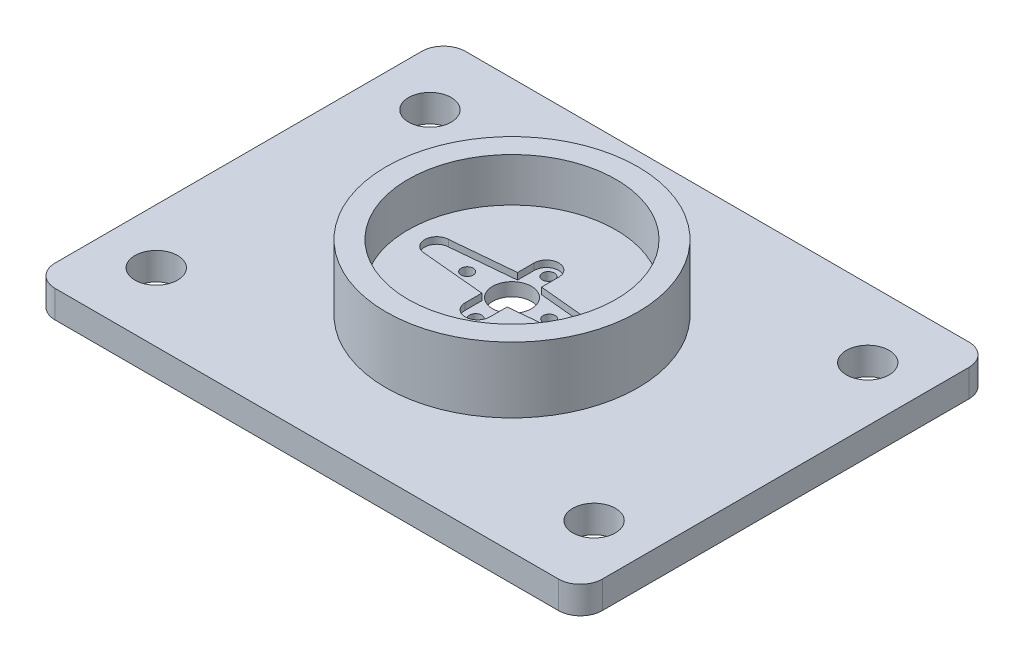
ISO-10303-21;
HEADER;
FILE_DESCRIPTION(('STEP AP214'),'2;1');
FILE_NAME('part.step','',(''),(''),'','','');
FILE_SCHEMA(('AUTOMOTIVE_DESIGN { 1 0 10303 214 1 1 1 1 }'));
ENDSEC;
DATA;
#1=APPLICATION_CONTEXT('core data for automotive mechanical design processes');
#2=APPLICATION_PROTOCOL_DEFINITION('international standard','automotive_design',2000,#1);
#3=PRODUCT_CONTEXT('',#1,'mechanical');
#4=PRODUCT('Part','Part','',(#3));
#5=PRODUCT_RELATED_PRODUCT_CATEGORY('part','',(#4));
#6=PRODUCT_DEFINITION_FORMATION('','',#4);
#7=PRODUCT_DEFINITION_CONTEXT('part definition',#1,'design');
#8=PRODUCT_DEFINITION('design','',#6,#7);
#9=PRODUCT_DEFINITION_SHAPE('','',#8);
#10=(LENGTH_UNIT() NAMED_UNIT(*) SI_UNIT(.MILLI.,.METRE.));
#11=(NAMED_UNIT(*) PLANE_ANGLE_UNIT() SI_UNIT($,.RADIAN.));
#12=(NAMED_UNIT(*) SI_UNIT($,.STERADIAN.) SOLID_ANGLE_UNIT());
#13=UNCERTAINTY_MEASURE_WITH_UNIT(LENGTH_MEASURE(1.E-05),#10,'distance_accuracy_value','');
#14=(GEOMETRIC_REPRESENTATION_CONTEXT(3) GLOBAL_UNCERTAINTY_ASSIGNED_CONTEXT((#13)) GLOBAL_UNIT_ASSIGNED_CONTEXT((#10,
#11,#12)) REPRESENTATION_CONTEXT('',''));
#15=CARTESIAN_POINT('',(0.,0.,0.));
#16=DIRECTION('',(0.,0.,1.));
#17=DIRECTION('',(1.,0.,0.));
#18=AXIS2_PLACEMENT_3D('',#15,#16,#17);
#19=CARTESIAN_POINT('',(0.,9.,0.));
#20=DIRECTION('',(0.,1.,0.));
#21=DIRECTION('',(0.,0.,1.));
#22=AXIS2_PLACEMENT_3D('',#19,#20,#21);
#23=PLANE('',#22);
#24=CARTESIAN_POINT('',(0.,9.,0.));
#25=DIRECTION('',(0.,1.,0.));
#26=DIRECTION('',(0.,0.,1.));
#27=AXIS2_PLACEMENT_3D('',#24,#25,#26);
#28=CIRCLE('',#27,19.);
#29=CARTESIAN_POINT('',(0.,9.,19.));
#30=VERTEX_POINT('',#29);
#31=EDGE_CURVE('E12',#30,#30,#28,.T.);
#32=ORIENTED_EDGE('',*,*,#31,.T.);
#33=EDGE_LOOP('',(#32));
#34=FACE_BOUND('',#33,.T.);
#35=DIRECTION('',(0.,0.,-1.));
#36=VECTOR('',#35,1.);
#37=CARTESIAN_POINT('',(2.25000000000002,9.,0.));
#38=LINE('',#37,#36);
#39=CARTESIAN_POINT('',(2.25000000000002,9.,6.3));
#40=VERTEX_POINT('',#39);
#41=CARTESIAN_POINT('',(2.25000000000002,9.,3.1454929822616));
#42=VERTEX_POINT('',#41);
#43=EDGE_CURVE('E241',#40,#42,#38,.T.);
#44=ORIENTED_EDGE('',*,*,#43,.F.);
#45=CARTESIAN_POINT('',(0.,9.,6.3));
#46=DIRECTION('',(0.,1.,0.));
#47=DIRECTION('',(0.,0.,1.));
#48=AXIS2_PLACEMENT_3D('',#45,#46,#47);
#49=CIRCLE('',#48,2.25000000000002);
#50=CARTESIAN_POINT('',(-2.25000000000002,9.,6.3));
#51=VERTEX_POINT('',#50);
#52=EDGE_CURVE('E246',#40,#51,#49,.F.);
#53=ORIENTED_EDGE('',*,*,#52,.T.);
#54=DIRECTION('',(0.,0.,-1.));
#55=VECTOR('',#54,1.);
#56=CARTESIAN_POINT('',(-2.25000000000002,9.,0.));
#57=LINE('',#56,#55);
#58=CARTESIAN_POINT('',(-2.25000000000002,9.,3.26473049395435));
#59=VERTEX_POINT('',#58);
#60=EDGE_CURVE('E66',#51,#59,#57,.T.);
#61=ORIENTED_EDGE('',*,*,#60,.T.);
#62=DIRECTION('',(0.995754888126229,0.,0.0920445694906601));
#63=VECTOR('',#62,1.);
#64=CARTESIAN_POINT('',(-0.318287509913616,9.,3.44329215270183));
#65=LINE('',#64,#63);
#66=CARTESIAN_POINT('',(-13.7693706378424,9.,2.19991472070841));
#67=VERTEX_POINT('',#66);
#68=EDGE_CURVE('E302',#67,#59,#65,.T.);
#69=ORIENTED_EDGE('',*,*,#68,.F.);
#70=CARTESIAN_POINT('',(-13.75,9.,0.));
#71=DIRECTION('',(0.,1.,0.));
#72=DIRECTION('',(0.,0.,1.));
#73=AXIS2_PLACEMENT_3D('',#70,#71,#72);
#74=CIRCLE('',#73,2.2);
#75=CARTESIAN_POINT('',(-13.7693706378424,9.,-2.19991472070841));
#76=VERTEX_POINT('',#75);
#77=EDGE_CURVE('E299',#76,#67,#74,.T.);
#78=ORIENTED_EDGE('',*,*,#77,.F.);
#79=DIRECTION('',(-0.995754888126229,0.,0.0920445694906599));
#80=VECTOR('',#79,1.);
#81=CARTESIAN_POINT('',(-0.318287509913615,9.,-3.44329215270183));
#82=LINE('',#81,#80);
#83=CARTESIAN_POINT('',(-2.25000000000002,9.,-3.26473049395435));
#84=VERTEX_POINT('',#83);
#85=EDGE_CURVE('E296',#84,#76,#82,.T.);
#86=ORIENTED_EDGE('',*,*,#85,.F.);
#87=DIRECTION('',(0.,0.,1.));
#88=VECTOR('',#87,1.);
#89=CARTESIAN_POINT('',(-2.25000000000002,9.,0.));
#90=LINE('',#89,#88);
#91=CARTESIAN_POINT('',(-2.25000000000002,9.,-6.3));
#92=VERTEX_POINT('',#91);
#93=EDGE_CURVE('E293',#92,#84,#90,.T.);
#94=ORIENTED_EDGE('',*,*,#93,.F.);
#95=CARTESIAN_POINT('',(0.,9.,-6.3));
#96=DIRECTION('',(0.,1.,0.));
#97=DIRECTION('',(0.,0.,1.));
#98=AXIS2_PLACEMENT_3D('',#95,#96,#97);
#99=CIRCLE('',#98,2.25000000000002);
#100=CARTESIAN_POINT('',(2.25000000000002,9.,-6.3));
#101=VERTEX_POINT('',#100);
#102=EDGE_CURVE('E290',#101,#92,#99,.T.);
#103=ORIENTED_EDGE('',*,*,#102,.F.);
#104=CARTESIAN_POINT('',(2.25000000000002,9.,-3.1454929822616));
#105=VERTEX_POINT('',#104);
#106=EDGE_CURVE('E281',#105,#101,#38,.T.);
#107=ORIENTED_EDGE('',*,*,#106,.F.);
#108=DIRECTION('',(0.995477891620518,0.,0.0949935118561688));
#109=VECTOR('',#108,1.);
#110=CARTESIAN_POINT('',(0.317753688889832,9.,-3.32987765258781));
#111=LINE('',#110,#109);
#112=CARTESIAN_POINT('',(16.35,9.,-1.8));
#113=VERTEX_POINT('',#112);
#114=EDGE_CURVE('E287',#105,#113,#111,.T.);
#115=ORIENTED_EDGE('',*,*,#114,.T.);
#116=CARTESIAN_POINT('',(16.35,9.,0.));
#117=DIRECTION('',(0.,1.,0.));
#118=DIRECTION('',(0.,0.,1.));
#119=AXIS2_PLACEMENT_3D('',#116,#117,#118);
#120=CIRCLE('',#119,1.8);
#121=CARTESIAN_POINT('',(16.35,9.,1.8));
#122=VERTEX_POINT('',#121);
#123=EDGE_CURVE('E284',#122,#113,#120,.T.);
#124=ORIENTED_EDGE('',*,*,#123,.F.);
#125=DIRECTION('',(0.995477891620518,0.,-0.0949935118561688));
#126=VECTOR('',#125,1.);
#127=CARTESIAN_POINT('',(0.317753688889832,9.,3.32987765258781));
#128=LINE('',#127,#126);
#129=EDGE_CURVE('E280',#42,#122,#128,.T.);
#130=ORIENTED_EDGE('',*,*,#129,.F.);
#131=EDGE_LOOP('',(#44,#53,#61,#69,#78,#86,#94,#103,#107,#115,#124,#130));
#132=FACE_BOUND('',#131,.T.);
#133=ADVANCED_FACE('F49',(#34,#132),#23,.T.);
#134=CARTESIAN_POINT('',(0.,5.,37.5));
#135=DIRECTION('',(0.,0.,-1.));
#136=DIRECTION('',(-1.,0.,0.));
#137=AXIS2_PLACEMENT_3D('',#134,#135,#136);
#138=PLANE('',#137);
#139=DIRECTION('',(1.,0.,0.));
#140=VECTOR('',#139,1.);
#141=CARTESIAN_POINT('',(0.,0.,37.5));
#142=LINE('',#141,#140);
#143=CARTESIAN_POINT('',(-46.,0.,37.5));
#144=VERTEX_POINT('',#143);
#145=CARTESIAN_POINT('',(46.,0.,37.5));
#146=VERTEX_POINT('',#145);
#147=EDGE_CURVE('E176',#144,#146,#142,.T.);
#148=ORIENTED_EDGE('',*,*,#147,.T.);
#149=DIRECTION('',(0.,-1.,0.));
#150=VECTOR('',#149,1.);
#151=CARTESIAN_POINT('',(46.,5.,37.5));
#152=LINE('',#151,#150);
#153=CARTESIAN_POINT('',(46.,5.,37.5));
#154=VERTEX_POINT('',#153);
#155=EDGE_CURVE('E58',#154,#146,#152,.T.);
#156=ORIENTED_EDGE('',*,*,#155,.F.);
#157=DIRECTION('',(1.,0.,0.));
#158=VECTOR('',#157,1.);
#159=CARTESIAN_POINT('',(0.,5.,37.5));
#160=LINE('',#159,#158);
#161=CARTESIAN_POINT('',(-46.,5.,37.5));
#162=VERTEX_POINT('',#161);
#163=EDGE_CURVE('E360',#162,#154,#160,.T.);
#164=ORIENTED_EDGE('',*,*,#163,.F.);
#165=DIRECTION('',(0.,-1.,0.));
#166=VECTOR('',#165,1.);
#167=CARTESIAN_POINT('',(-46.,5.,37.5));
#168=LINE('',#167,#166);
#169=EDGE_CURVE('E75',#162,#144,#168,.T.);
#170=ORIENTED_EDGE('',*,*,#169,.T.);
#171=EDGE_LOOP('',(#148,#156,#164,#170));
#172=FACE_BOUND('',#171,.T.);
#173=ADVANCED_FACE('F377',(#172),#138,.F.);
#174=CARTESIAN_POINT('',(46.,5.,33.5));
#175=DIRECTION('',(0.,-1.,0.));
#176=DIRECTION('',(0.,0.,-1.));
#177=AXIS2_PLACEMENT_3D('',#174,#175,#176);
#178=CYLINDRICAL_SURFACE('',#177,4.00000000000001);
#179=CARTESIAN_POINT('',(46.,0.,33.5));
#180=DIRECTION('',(0.,1.,0.));
#181=DIRECTION('',(0.,0.,1.));
#182=AXIS2_PLACEMENT_3D('',#179,#180,#181);
#183=CIRCLE('',#182,4.00000000000001);
#184=CARTESIAN_POINT('',(50.,0.,33.5));
#185=VERTEX_POINT('',#184);
#186=EDGE_CURVE('E178',#146,#185,#183,.T.);
#187=ORIENTED_EDGE('',*,*,#186,.T.);
#188=DIRECTION('',(0.,-1.,0.));
#189=VECTOR('',#188,1.);
#190=CARTESIAN_POINT('',(50.,5.,33.5));
#191=LINE('',#190,#189);
#192=CARTESIAN_POINT('',(50.,5.,33.5));
#193=VERTEX_POINT('',#192);
#194=EDGE_CURVE('E204',#193,#185,#191,.T.);
#195=ORIENTED_EDGE('',*,*,#194,.F.);
#196=CARTESIAN_POINT('',(46.,5.,33.5));
#197=DIRECTION('',(0.,1.,0.));
#198=DIRECTION('',(0.,0.,1.));
#199=AXIS2_PLACEMENT_3D('',#196,#197,#198);
#200=CIRCLE('',#199,4.00000000000001);
#201=EDGE_CURVE('E115',#154,#193,#200,.T.);
#202=ORIENTED_EDGE('',*,*,#201,.F.);
#203=ORIENTED_EDGE('',*,*,#155,.T.);
#204=EDGE_LOOP('',(#187,#195,#202,#203));
#205=FACE_BOUND('',#204,.T.);
#206=ADVANCED_FACE('F378',(#205),#178,.T.);
#207=CARTESIAN_POINT('',(50.,5.,0.));
#208=DIRECTION('',(1.,0.,0.));
#209=DIRECTION('',(0.,0.,-1.));
#210=AXIS2_PLACEMENT_3D('',#207,#208,#209);
#211=PLANE('',#210);
#212=DIRECTION('',(0.,0.,1.));
#213=VECTOR('',#212,1.);
#214=CARTESIAN_POINT('',(50.,0.,0.));
#215=LINE('',#214,#213);
#216=CARTESIAN_POINT('',(50.,0.,-33.5));
#217=VERTEX_POINT('',#216);
#218=EDGE_CURVE('E181',#217,#185,#215,.T.);
#219=ORIENTED_EDGE('',*,*,#218,.F.);
#220=DIRECTION('',(0.,-1.,0.));
#221=VECTOR('',#220,1.);
#222=CARTESIAN_POINT('',(50.,5.,-33.5));
#223=LINE('',#222,#221);
#224=CARTESIAN_POINT('',(50.,5.,-33.5));
#225=VERTEX_POINT('',#224);
#226=EDGE_CURVE('E202',#225,#217,#223,.T.);
#227=ORIENTED_EDGE('',*,*,#226,.F.);
#228=DIRECTION('',(0.,0.,1.));
#229=VECTOR('',#228,1.);
#230=CARTESIAN_POINT('',(50.,5.,0.));
#231=LINE('',#230,#229);
#232=EDGE_CURVE('E363',#225,#193,#231,.T.);
#233=ORIENTED_EDGE('',*,*,#232,.T.);
#234=ORIENTED_EDGE('',*,*,#194,.T.);
#235=EDGE_LOOP('',(#219,#227,#233,#234));
#236=FACE_BOUND('',#235,.T.);
#237=ADVANCED_FACE('F381',(#236),#211,.T.);
#238=CARTESIAN_POINT('',(46.,5.,-33.5));
#239=DIRECTION('',(0.,-1.,0.));
#240=DIRECTION('',(0.,0.,-1.));
#241=AXIS2_PLACEMENT_3D('',#238,#239,#240);
#242=CYLINDRICAL_SURFACE('',#241,4.00000000000001);
#243=CARTESIAN_POINT('',(46.,0.,-33.5));
#244=DIRECTION('',(0.,1.,0.));
#245=DIRECTION('',(0.,0.,1.));
#246=AXIS2_PLACEMENT_3D('',#243,#244,#245);
#247=CIRCLE('',#246,4.00000000000001);
#248=CARTESIAN_POINT('',(46.,0.,-37.5));
#249=VERTEX_POINT('',#248);
#250=EDGE_CURVE('E184',#249,#217,#247,.F.);
#251=ORIENTED_EDGE('',*,*,#250,.F.);
#252=DIRECTION('',(0.,-1.,0.));
#253=VECTOR('',#252,1.);
#254=CARTESIAN_POINT('',(46.,5.,-37.5));
#255=LINE('',#254,#253);
#256=CARTESIAN_POINT('',(46.,5.,-37.5));
#257=VERTEX_POINT('',#256);
#258=EDGE_CURVE('E200',#257,#249,#255,.T.);
#259=ORIENTED_EDGE('',*,*,#258,.F.);
#260=CARTESIAN_POINT('',(46.,5.,-33.5));
#261=DIRECTION('',(0.,1.,0.));
#262=DIRECTION('',(0.,0.,1.));
#263=AXIS2_PLACEMENT_3D('',#260,#261,#262);
#264=CIRCLE('',#263,4.00000000000001);
#265=EDGE_CURVE('E366',#257,#225,#264,.F.);
#266=ORIENTED_EDGE('',*,*,#265,.T.);
#267=ORIENTED_EDGE('',*,*,#226,.T.);
#268=EDGE_LOOP('',(#251,#259,#266,#267));
#269=FACE_BOUND('',#268,.T.);
#270=ADVANCED_FACE('F383',(#269),#242,.T.);
#271=CARTESIAN_POINT('',(0.,5.,-37.5));
#272=DIRECTION('',(0.,0.,-1.));
#273=DIRECTION('',(-1.,0.,0.));
#274=AXIS2_PLACEMENT_3D('',#271,#272,#273);
#275=PLANE('',#274);
#276=DIRECTION('',(1.,0.,0.));
#277=VECTOR('',#276,1.);
#278=CARTESIAN_POINT('',(0.,0.,-37.5));
#279=LINE('',#278,#277);
#280=CARTESIAN_POINT('',(-46.,0.,-37.5));
#281=VERTEX_POINT('',#280);
#282=EDGE_CURVE('E187',#281,#249,#279,.T.);
#283=ORIENTED_EDGE('',*,*,#282,.F.);
#284=DIRECTION('',(0.,-1.,0.));
#285=VECTOR('',#284,1.);
#286=CARTESIAN_POINT('',(-46.,5.,-37.5));
#287=LINE('',#286,#285);
#288=CARTESIAN_POINT('',(-46.,5.,-37.5));
#289=VERTEX_POINT('',#288);
#290=EDGE_CURVE('E154',#289,#281,#287,.T.);
#291=ORIENTED_EDGE('',*,*,#290,.F.);
#292=DIRECTION('',(1.,0.,0.));
#293=VECTOR('',#292,1.);
#294=CARTESIAN_POINT('',(0.,5.,-37.5));
#295=LINE('',#294,#293);
#296=EDGE_CURVE('E143',#289,#257,#295,.T.);
#297=ORIENTED_EDGE('',*,*,#296,.T.);
#298=ORIENTED_EDGE('',*,*,#258,.T.);
#299=EDGE_LOOP('',(#283,#291,#297,#298));
#300=FACE_BOUND('',#299,.T.);
#301=ADVANCED_FACE('F370',(#300),#275,.T.);
#302=CARTESIAN_POINT('',(-46.,5.,-33.5));
#303=DIRECTION('',(0.,-1.,0.));
#304=DIRECTION('',(0.,0.,-1.));
#305=AXIS2_PLACEMENT_3D('',#302,#303,#304);
#306=CYLINDRICAL_SURFACE('',#305,4.00000000000001);
#307=CARTESIAN_POINT('',(-46.,0.,-33.5));
#308=DIRECTION('',(0.,1.,0.));
#309=DIRECTION('',(0.,0.,1.));
#310=AXIS2_PLACEMENT_3D('',#307,#308,#309);
#311=CIRCLE('',#310,4.00000000000001);
#312=CARTESIAN_POINT('',(-50.,0.,-33.5));
#313=VERTEX_POINT('',#312);
#314=EDGE_CURVE('E150',#281,#313,#311,.T.);
#315=ORIENTED_EDGE('',*,*,#314,.T.);
#316=DIRECTION('',(0.,-1.,0.));
#317=VECTOR('',#316,1.);
#318=CARTESIAN_POINT('',(-50.,5.,-33.5));
#319=LINE('',#318,#317);
#320=CARTESIAN_POINT('',(-50.,5.,-33.5));
#321=VERTEX_POINT('',#320);
#322=EDGE_CURVE('E147',#321,#313,#319,.T.);
#323=ORIENTED_EDGE('',*,*,#322,.F.);
#324=CARTESIAN_POINT('',(-46.,5.,-33.5));
#325=DIRECTION('',(0.,1.,0.));
#326=DIRECTION('',(0.,0.,1.));
#327=AXIS2_PLACEMENT_3D('',#324,#325,#326);
#328=CIRCLE('',#327,4.00000000000001);
#329=EDGE_CURVE('E134',#289,#321,#328,.T.);
#330=ORIENTED_EDGE('',*,*,#329,.F.);
#331=ORIENTED_EDGE('',*,*,#290,.T.);
#332=EDGE_LOOP('',(#315,#323,#330,#331));
#333=FACE_BOUND('',#332,.T.);
#334=ADVANCED_FACE('F148',(#333),#306,.T.);
#335=CARTESIAN_POINT('',(-50.,5.,0.));
#336=DIRECTION('',(1.,0.,0.));
#337=DIRECTION('',(0.,0.,-1.));
#338=AXIS2_PLACEMENT_3D('',#335,#336,#337);
#339=PLANE('',#338);
#340=DIRECTION('',(0.,0.,1.));
#341=VECTOR('',#340,1.);
#342=CARTESIAN_POINT('',(-50.,0.,0.));
#343=LINE('',#342,#341);
#344=CARTESIAN_POINT('',(-50.,0.,33.5));
#345=VERTEX_POINT('',#344);
#346=EDGE_CURVE('E191',#313,#345,#343,.T.);
#347=ORIENTED_EDGE('',*,*,#346,.T.);
#348=DIRECTION('',(0.,-1.,0.));
#349=VECTOR('',#348,1.);
#350=CARTESIAN_POINT('',(-50.,5.,33.5));
#351=LINE('',#350,#349);
#352=CARTESIAN_POINT('',(-50.,5.,33.5));
#353=VERTEX_POINT('',#352);
#354=EDGE_CURVE('E155',#353,#345,#351,.T.);
#355=ORIENTED_EDGE('',*,*,#354,.F.);
#356=DIRECTION('',(0.,0.,1.));
#357=VECTOR('',#356,1.);
#358=CARTESIAN_POINT('',(-50.,5.,0.));
#359=LINE('',#358,#357);
#360=EDGE_CURVE('E139',#321,#353,#359,.T.);
#361=ORIENTED_EDGE('',*,*,#360,.F.);
#362=ORIENTED_EDGE('',*,*,#322,.T.);
#363=EDGE_LOOP('',(#347,#355,#361,#362));
#364=FACE_BOUND('',#363,.T.);
#365=ADVANCED_FACE('F157',(#364),#339,.F.);
#366=CARTESIAN_POINT('',(40.,5.,-25.));
#367=DIRECTION('',(0.,-1.,0.));
#368=DIRECTION('',(0.,0.,-1.));
#369=AXIS2_PLACEMENT_3D('',#366,#367,#368);
#370=CYLINDRICAL_SURFACE('',#369,3.9);
#371=CARTESIAN_POINT('',(40.,5.,-25.));
#372=DIRECTION('',(0.,1.,0.));
#373=DIRECTION('',(0.,0.,1.));
#374=AXIS2_PLACEMENT_3D('',#371,#372,#373);
#375=CIRCLE('',#374,3.9);
#376=CARTESIAN_POINT('',(40.,5.,-21.1));
#377=VERTEX_POINT('',#376);
#378=EDGE_CURVE('E357',#377,#377,#375,.F.);
#379=ORIENTED_EDGE('',*,*,#378,.F.);
#380=EDGE_LOOP('',(#379));
#381=FACE_BOUND('',#380,.T.);
#382=CARTESIAN_POINT('',(40.,0.,-25.));
#383=DIRECTION('',(0.,1.,0.));
#384=DIRECTION('',(0.,0.,1.));
#385=AXIS2_PLACEMENT_3D('',#382,#383,#384);
#386=CIRCLE('',#385,3.9);
#387=CARTESIAN_POINT('',(40.,0.,-21.1));
#388=VERTEX_POINT('',#387);
#389=EDGE_CURVE('E173',#388,#388,#386,.F.);
#390=ORIENTED_EDGE('',*,*,#389,.T.);
#391=EDGE_LOOP('',(#390));
#392=FACE_BOUND('',#391,.T.);
#393=ADVANCED_FACE('F428',(#381,#392),#370,.F.);
#394=CARTESIAN_POINT('',(40.,5.,25.));
#395=DIRECTION('',(0.,-1.,0.));
#396=DIRECTION('',(0.,0.,-1.));
#397=AXIS2_PLACEMENT_3D('',#394,#395,#396);
#398=CYLINDRICAL_SURFACE('',#397,3.9);
#399=CARTESIAN_POINT('',(40.,5.,25.));
#400=DIRECTION('',(0.,1.,0.));
#401=DIRECTION('',(0.,0.,1.));
#402=AXIS2_PLACEMENT_3D('',#399,#400,#401);
#403=CIRCLE('',#402,3.9);
#404=CARTESIAN_POINT('',(40.,5.,28.9));
#405=VERTEX_POINT('',#404);
#406=EDGE_CURVE('E354',#405,#405,#403,.T.);
#407=ORIENTED_EDGE('',*,*,#406,.T.);
#408=EDGE_LOOP('',(#407));
#409=FACE_BOUND('',#408,.T.);
#410=CARTESIAN_POINT('',(40.,0.,25.));
#411=DIRECTION('',(0.,1.,0.));
#412=DIRECTION('',(0.,0.,1.));
#413=AXIS2_PLACEMENT_3D('',#410,#411,#412);
#414=CIRCLE('',#413,3.9);
#415=CARTESIAN_POINT('',(40.,0.,28.9));
#416=VERTEX_POINT('',#415);
#417=EDGE_CURVE('E170',#416,#416,#414,.T.);
#418=ORIENTED_EDGE('',*,*,#417,.F.);
#419=EDGE_LOOP('',(#418));
#420=FACE_BOUND('',#419,.T.);
#421=ADVANCED_FACE('F446',(#409,#420),#398,.F.);
#422=CARTESIAN_POINT('',(-40.,5.,-25.));
#423=DIRECTION('',(0.,-1.,0.));
#424=DIRECTION('',(0.,0.,-1.));
#425=AXIS2_PLACEMENT_3D('',#422,#423,#424);
#426=CYLINDRICAL_SURFACE('',#425,3.9);
#427=CARTESIAN_POINT('',(-40.,5.,-25.));
#428=DIRECTION('',(0.,1.,0.));
#429=DIRECTION('',(0.,0.,1.));
#430=AXIS2_PLACEMENT_3D('',#427,#428,#429);
#431=CIRCLE('',#430,3.9);
#432=CARTESIAN_POINT('',(-40.,5.,-21.1));
#433=VERTEX_POINT('',#432);
#434=EDGE_CURVE('E351',#433,#433,#431,.T.);
#435=ORIENTED_EDGE('',*,*,#434,.T.);
#436=EDGE_LOOP('',(#435));
#437=FACE_BOUND('',#436,.T.);
#438=CARTESIAN_POINT('',(-40.,0.,-25.));
#439=DIRECTION('',(0.,1.,0.));
#440=DIRECTION('',(0.,0.,1.));
#441=AXIS2_PLACEMENT_3D('',#438,#439,#440);
#442=CIRCLE('',#441,3.9);
#443=CARTESIAN_POINT('',(-40.,0.,-21.1));
#444=VERTEX_POINT('',#443);
#445=EDGE_CURVE('E166',#444,#444,#442,.T.);
#446=ORIENTED_EDGE('',*,*,#445,.F.);
#447=EDGE_LOOP('',(#446));
#448=FACE_BOUND('',#447,.T.);
#449=ADVANCED_FACE('F455',(#437,#448),#426,.F.);
#450=CARTESIAN_POINT('',(-40.,5.,25.));
#451=DIRECTION('',(0.,-1.,0.));
#452=DIRECTION('',(0.,0.,-1.));
#453=AXIS2_PLACEMENT_3D('',#450,#451,#452);
#454=CYLINDRICAL_SURFACE('',#453,3.9);
#455=CARTESIAN_POINT('',(-40.,5.,25.));
#456=DIRECTION('',(0.,1.,0.));
#457=DIRECTION('',(0.,0.,1.));
#458=AXIS2_PLACEMENT_3D('',#455,#456,#457);
#459=CIRCLE('',#458,3.9);
#460=CARTESIAN_POINT('',(-40.,5.,28.9));
#461=VERTEX_POINT('',#460);
#462=EDGE_CURVE('E196',#461,#461,#459,.F.);
#463=ORIENTED_EDGE('',*,*,#462,.F.);
#464=EDGE_LOOP('',(#463));
#465=FACE_BOUND('',#464,.T.);
#466=CARTESIAN_POINT('',(-40.,0.,25.));
#467=DIRECTION('',(0.,1.,0.));
#468=DIRECTION('',(0.,0.,1.));
#469=AXIS2_PLACEMENT_3D('',#466,#467,#468);
#470=CIRCLE('',#469,3.9);
#471=CARTESIAN_POINT('',(-40.,0.,28.9));
#472=VERTEX_POINT('',#471);
#473=EDGE_CURVE('E163',#472,#472,#470,.F.);
#474=ORIENTED_EDGE('',*,*,#473,.T.);
#475=EDGE_LOOP('',(#474));
#476=FACE_BOUND('',#475,.T.);
#477=ADVANCED_FACE('F51',(#465,#476),#454,.F.);
#478=CARTESIAN_POINT('',(-46.,5.,33.5));
#479=DIRECTION('',(0.,-1.,0.));
#480=DIRECTION('',(0.,0.,-1.));
#481=AXIS2_PLACEMENT_3D('',#478,#479,#480);
#482=CYLINDRICAL_SURFACE('',#481,4.00000000000001);
#483=CARTESIAN_POINT('',(-46.,0.,33.5));
#484=DIRECTION('',(0.,1.,0.));
#485=DIRECTION('',(0.,0.,1.));
#486=AXIS2_PLACEMENT_3D('',#483,#484,#485);
#487=CIRCLE('',#486,4.00000000000001);
#488=EDGE_CURVE('E193',#144,#345,#487,.F.);
#489=ORIENTED_EDGE('',*,*,#488,.F.);
#490=ORIENTED_EDGE('',*,*,#169,.F.);
#491=CARTESIAN_POINT('',(-46.,5.,33.5));
#492=DIRECTION('',(0.,1.,0.));
#493=DIRECTION('',(0.,0.,1.));
#494=AXIS2_PLACEMENT_3D('',#491,#492,#493);
#495=CIRCLE('',#494,4.00000000000001);
#496=EDGE_CURVE('E158',#162,#353,#495,.F.);
#497=ORIENTED_EDGE('',*,*,#496,.T.);
#498=ORIENTED_EDGE('',*,*,#354,.T.);
#499=EDGE_LOOP('',(#489,#490,#497,#498));
#500=FACE_BOUND('',#499,.T.);
#501=ADVANCED_FACE('F374',(#500),#482,.T.);
#502=CARTESIAN_POINT('',(0.,5.,0.));
#503=DIRECTION('',(0.,1.,0.));
#504=DIRECTION('',(0.,0.,1.));
#505=AXIS2_PLACEMENT_3D('',#502,#503,#504);
#506=PLANE('',#505);
#507=CARTESIAN_POINT('',(0.,5.,0.));
#508=DIRECTION('',(0.,1.,0.));
#509=DIRECTION('',(0.,0.,1.));
#510=AXIS2_PLACEMENT_3D('',#507,#508,#509);
#511=CIRCLE('',#510,23.);
#512=CARTESIAN_POINT('',(0.,5.,23.));
#513=VERTEX_POINT('',#512);
#514=EDGE_CURVE('E344',#513,#513,#511,.T.);
#515=ORIENTED_EDGE('',*,*,#514,.F.);
#516=EDGE_LOOP('',(#515));
#517=FACE_BOUND('',#516,.T.);
#518=ORIENTED_EDGE('',*,*,#462,.T.);
#519=EDGE_LOOP('',(#518));
#520=FACE_BOUND('',#519,.T.);
#521=ORIENTED_EDGE('',*,*,#434,.F.);
#522=EDGE_LOOP('',(#521));
#523=FACE_BOUND('',#522,.T.);
#524=ORIENTED_EDGE('',*,*,#406,.F.);
#525=EDGE_LOOP('',(#524));
#526=FACE_BOUND('',#525,.T.);
#527=ORIENTED_EDGE('',*,*,#378,.T.);
#528=EDGE_LOOP('',(#527));
#529=FACE_BOUND('',#528,.T.);
#530=ORIENTED_EDGE('',*,*,#163,.T.);
#531=ORIENTED_EDGE('',*,*,#201,.T.);
#532=ORIENTED_EDGE('',*,*,#232,.F.);
#533=ORIENTED_EDGE('',*,*,#265,.F.);
#534=ORIENTED_EDGE('',*,*,#296,.F.);
#535=ORIENTED_EDGE('',*,*,#329,.T.);
#536=ORIENTED_EDGE('',*,*,#360,.T.);
#537=ORIENTED_EDGE('',*,*,#496,.F.);
#538=EDGE_LOOP('',(#530,#531,#532,#533,#534,#535,#536,#537));
#539=FACE_BOUND('',#538,.T.);
#540=ADVANCED_FACE('F136',(#517,#520,#523,#526,#529,#539),#506,.T.);
#541=CARTESIAN_POINT('',(0.,0.,0.));
#542=DIRECTION('',(0.,1.,0.));
#543=DIRECTION('',(0.,0.,1.));
#544=AXIS2_PLACEMENT_3D('',#541,#542,#543);
#545=PLANE('',#544);
#546=CARTESIAN_POINT('',(0.,0.,0.));
#547=DIRECTION('',(0.,-1.,0.));
#548=DIRECTION('',(0.,0.,-1.));
#549=AXIS2_PLACEMENT_3D('',#546,#547,#548);
#550=CIRCLE('',#549,19.);
#551=CARTESIAN_POINT('',(0.,0.,-19.));
#552=VERTEX_POINT('',#551);
#553=EDGE_CURVE('E226',#552,#552,#550,.T.);
#554=ORIENTED_EDGE('',*,*,#553,.F.);
#555=EDGE_LOOP('',(#554));
#556=FACE_BOUND('',#555,.T.);
#557=ORIENTED_EDGE('',*,*,#473,.F.);
#558=EDGE_LOOP('',(#557));
#559=FACE_BOUND('',#558,.T.);
#560=ORIENTED_EDGE('',*,*,#445,.T.);
#561=EDGE_LOOP('',(#560));
#562=FACE_BOUND('',#561,.T.);
#563=ORIENTED_EDGE('',*,*,#417,.T.);
#564=EDGE_LOOP('',(#563));
#565=FACE_BOUND('',#564,.T.);
#566=ORIENTED_EDGE('',*,*,#389,.F.);
#567=EDGE_LOOP('',(#566));
#568=FACE_BOUND('',#567,.T.);
#569=ORIENTED_EDGE('',*,*,#147,.F.);
#570=ORIENTED_EDGE('',*,*,#488,.T.);
#571=ORIENTED_EDGE('',*,*,#346,.F.);
#572=ORIENTED_EDGE('',*,*,#314,.F.);
#573=ORIENTED_EDGE('',*,*,#282,.T.);
#574=ORIENTED_EDGE('',*,*,#250,.T.);
#575=ORIENTED_EDGE('',*,*,#218,.T.);
#576=ORIENTED_EDGE('',*,*,#186,.F.);
#577=EDGE_LOOP('',(#569,#570,#571,#572,#573,#574,#575,#576));
#578=FACE_BOUND('',#577,.T.);
#579=ADVANCED_FACE('F373',(#556,#559,#562,#565,#568,#578),#545,.F.);
#580=CARTESIAN_POINT('',(0.,17.,0.));
#581=DIRECTION('',(0.,1.,0.));
#582=DIRECTION('',(0.,0.,1.));
#583=AXIS2_PLACEMENT_3D('',#580,#581,#582);
#584=PLANE('',#583);
#585=CARTESIAN_POINT('',(0.,17.,0.));
#586=DIRECTION('',(0.,1.,0.));
#587=DIRECTION('',(0.,0.,1.));
#588=AXIS2_PLACEMENT_3D('',#585,#586,#587);
#589=CIRCLE('',#588,23.);
#590=CARTESIAN_POINT('',(0.,17.,23.));
#591=VERTEX_POINT('',#590);
#592=EDGE_CURVE('E167',#591,#591,#589,.T.);
#593=ORIENTED_EDGE('',*,*,#592,.T.);
#594=EDGE_LOOP('',(#593));
#595=FACE_BOUND('',#594,.T.);
#596=CARTESIAN_POINT('',(0.,17.,0.));
#597=DIRECTION('',(0.,1.,0.));
#598=DIRECTION('',(0.,0.,1.));
#599=AXIS2_PLACEMENT_3D('',#596,#597,#598);
#600=CIRCLE('',#599,19.);
#601=CARTESIAN_POINT('',(0.,17.,19.));
#602=VERTEX_POINT('',#601);
#603=EDGE_CURVE('E311',#602,#602,#600,.T.);
#604=ORIENTED_EDGE('',*,*,#603,.F.);
#605=EDGE_LOOP('',(#604));
#606=FACE_BOUND('',#605,.T.);
#607=ADVANCED_FACE('F411',(#595,#606),#584,.T.);
#608=CARTESIAN_POINT('',(0.,17.,0.));
#609=DIRECTION('',(0.,-1.,0.));
#610=DIRECTION('',(0.,0.,-1.));
#611=AXIS2_PLACEMENT_3D('',#608,#609,#610);
#612=CYLINDRICAL_SURFACE('',#611,23.);
#613=ORIENTED_EDGE('',*,*,#592,.F.);
#614=EDGE_LOOP('',(#613));
#615=FACE_BOUND('',#614,.T.);
#616=ORIENTED_EDGE('',*,*,#514,.T.);
#617=EDGE_LOOP('',(#616));
#618=FACE_BOUND('',#617,.T.);
#619=ADVANCED_FACE('F409',(#615,#618),#612,.T.);
#620=CARTESIAN_POINT('',(0.,17.,0.));
#621=DIRECTION('',(0.,-1.,0.));
#622=DIRECTION('',(0.,0.,-1.));
#623=AXIS2_PLACEMENT_3D('',#620,#621,#622);
#624=CYLINDRICAL_SURFACE('',#623,19.);
#625=ORIENTED_EDGE('',*,*,#31,.F.);
#626=EDGE_LOOP('',(#625));
#627=FACE_BOUND('',#626,.T.);
#628=ORIENTED_EDGE('',*,*,#603,.T.);
#629=EDGE_LOOP('',(#628));
#630=FACE_BOUND('',#629,.T.);
#631=ADVANCED_FACE('F406',(#627,#630),#624,.F.);
#632=CARTESIAN_POINT('',(2.25000000000002,7.8,0.));
#633=DIRECTION('',(1.,0.,0.));
#634=DIRECTION('',(0.,0.,-1.));
#635=AXIS2_PLACEMENT_3D('',#632,#633,#634);
#636=PLANE('',#635);
#637=ORIENTED_EDGE('',*,*,#43,.T.);
#638=DIRECTION('',(0.,1.,0.));
#639=VECTOR('',#638,1.);
#640=CARTESIAN_POINT('',(2.25000000000002,7.8,3.1454929822616));
#641=LINE('',#640,#639);
#642=CARTESIAN_POINT('',(2.25000000000002,7.8,3.1454929822616));
#643=VERTEX_POINT('',#642);
#644=EDGE_CURVE('E277',#643,#42,#641,.T.);
#645=ORIENTED_EDGE('',*,*,#644,.F.);
#646=DIRECTION('',(0.,0.,-1.));
#647=VECTOR('',#646,1.);
#648=CARTESIAN_POINT('',(2.25000000000002,7.8,0.));
#649=LINE('',#648,#647);
#650=CARTESIAN_POINT('',(2.25000000000002,7.8,6.3));
#651=VERTEX_POINT('',#650);
#652=EDGE_CURVE('E242',#651,#643,#649,.T.);
#653=ORIENTED_EDGE('',*,*,#652,.F.);
#654=DIRECTION('',(0.,1.,0.));
#655=VECTOR('',#654,1.);
#656=CARTESIAN_POINT('',(2.25000000000002,7.8,6.3));
#657=LINE('',#656,#655);
#658=EDGE_CURVE('E308',#651,#40,#657,.T.);
#659=ORIENTED_EDGE('',*,*,#658,.T.);
#660=EDGE_LOOP('',(#637,#645,#653,#659));
#661=FACE_BOUND('',#660,.T.);
#662=ADVANCED_FACE('F408',(#661),#636,.F.);
#663=CARTESIAN_POINT('',(0.,7.8,6.3));
#664=DIRECTION('',(0.,1.,0.));
#665=DIRECTION('',(0.,0.,1.));
#666=AXIS2_PLACEMENT_3D('',#663,#664,#665);
#667=CYLINDRICAL_SURFACE('',#666,2.25000000000002);
#668=ORIENTED_EDGE('',*,*,#52,.F.);
#669=ORIENTED_EDGE('',*,*,#658,.F.);
#670=CARTESIAN_POINT('',(0.,7.8,6.3));
#671=DIRECTION('',(0.,1.,0.));
#672=DIRECTION('',(0.,0.,1.));
#673=AXIS2_PLACEMENT_3D('',#670,#671,#672);
#674=CIRCLE('',#673,2.25000000000002);
#675=CARTESIAN_POINT('',(-2.25000000000002,7.8,6.3));
#676=VERTEX_POINT('',#675);
#677=EDGE_CURVE('E274',#651,#676,#674,.F.);
#678=ORIENTED_EDGE('',*,*,#677,.T.);
#679=DIRECTION('',(0.,1.,0.));
#680=VECTOR('',#679,1.);
#681=CARTESIAN_POINT('',(-2.25000000000002,7.8,6.3));
#682=LINE('',#681,#680);
#683=EDGE_CURVE('E312',#676,#51,#682,.T.);
#684=ORIENTED_EDGE('',*,*,#683,.T.);
#685=EDGE_LOOP('',(#668,#669,#678,#684));
#686=FACE_BOUND('',#685,.T.);
#687=ADVANCED_FACE('F510',(#686),#667,.F.);
#688=CARTESIAN_POINT('',(-2.25000000000002,7.8,0.));
#689=DIRECTION('',(1.,0.,0.));
#690=DIRECTION('',(0.,0.,-1.));
#691=AXIS2_PLACEMENT_3D('',#688,#689,#690);
#692=PLANE('',#691);
#693=ORIENTED_EDGE('',*,*,#60,.F.);
#694=ORIENTED_EDGE('',*,*,#683,.F.);
#695=DIRECTION('',(0.,0.,-1.));
#696=VECTOR('',#695,1.);
#697=CARTESIAN_POINT('',(-2.25000000000002,7.8,0.));
#698=LINE('',#697,#696);
#699=CARTESIAN_POINT('',(-2.25000000000002,7.8,3.26473049395435));
#700=VERTEX_POINT('',#699);
#701=EDGE_CURVE('E271',#676,#700,#698,.T.);
#702=ORIENTED_EDGE('',*,*,#701,.T.);
#703=DIRECTION('',(0.,1.,0.));
#704=VECTOR('',#703,1.);
#705=CARTESIAN_POINT('',(-2.25000000000002,7.8,3.26473049395435));
#706=LINE('',#705,#704);
#707=EDGE_CURVE('E314',#700,#59,#706,.T.);
#708=ORIENTED_EDGE('',*,*,#707,.T.);
#709=EDGE_LOOP('',(#693,#694,#702,#708));
#710=FACE_BOUND('',#709,.T.);
#711=ADVANCED_FACE('F524',(#710),#692,.T.);
#712=CARTESIAN_POINT('',(-0.318287509913616,7.8,3.44329215270183));
#713=DIRECTION('',(-0.0920445694906601,0.,0.995754888126229));
#714=DIRECTION('',(0.995754888126229,0.,0.0920445694906601));
#715=AXIS2_PLACEMENT_3D('',#712,#713,#714);
#716=PLANE('',#715);
#717=ORIENTED_EDGE('',*,*,#68,.T.);
#718=ORIENTED_EDGE('',*,*,#707,.F.);
#719=DIRECTION('',(0.995754888126229,0.,0.0920445694906601));
#720=VECTOR('',#719,1.);
#721=CARTESIAN_POINT('',(-0.318287509913616,7.8,3.44329215270183));
#722=LINE('',#721,#720);
#723=CARTESIAN_POINT('',(-13.7693706378424,7.8,2.19991472070841));
#724=VERTEX_POINT('',#723);
#725=EDGE_CURVE('E268',#724,#700,#722,.T.);
#726=ORIENTED_EDGE('',*,*,#725,.F.);
#727=DIRECTION('',(0.,1.,0.));
#728=VECTOR('',#727,1.);
#729=CARTESIAN_POINT('',(-13.7693706378424,7.8,2.19991472070841));
#730=LINE('',#729,#728);
#731=EDGE_CURVE('E316',#724,#67,#730,.T.);
#732=ORIENTED_EDGE('',*,*,#731,.T.);
#733=EDGE_LOOP('',(#717,#718,#726,#732));
#734=FACE_BOUND('',#733,.T.);
#735=ADVANCED_FACE('F534',(#734),#716,.F.);
#736=CARTESIAN_POINT('',(-13.75,7.8,0.));
#737=DIRECTION('',(0.,1.,0.));
#738=DIRECTION('',(0.,0.,1.));
#739=AXIS2_PLACEMENT_3D('',#736,#737,#738);
#740=CYLINDRICAL_SURFACE('',#739,2.2);
#741=ORIENTED_EDGE('',*,*,#77,.T.);
#742=ORIENTED_EDGE('',*,*,#731,.F.);
#743=CARTESIAN_POINT('',(-13.75,7.8,0.));
#744=DIRECTION('',(0.,1.,0.));
#745=DIRECTION('',(0.,0.,1.));
#746=AXIS2_PLACEMENT_3D('',#743,#744,#745);
#747=CIRCLE('',#746,2.2);
#748=CARTESIAN_POINT('',(-13.7693706378424,7.8,-2.19991472070841));
#749=VERTEX_POINT('',#748);
#750=EDGE_CURVE('E265',#749,#724,#747,.T.);
#751=ORIENTED_EDGE('',*,*,#750,.F.);
#752=DIRECTION('',(0.,1.,0.));
#753=VECTOR('',#752,1.);
#754=CARTESIAN_POINT('',(-13.7693706378424,7.8,-2.19991472070841));
#755=LINE('',#754,#753);
#756=EDGE_CURVE('E319',#749,#76,#755,.T.);
#757=ORIENTED_EDGE('',*,*,#756,.T.);
#758=EDGE_LOOP('',(#741,#742,#751,#757));
#759=FACE_BOUND('',#758,.T.);
#760=ADVANCED_FACE('F543',(#759),#740,.F.);
#761=CARTESIAN_POINT('',(-0.318287509913615,7.8,-3.44329215270183));
#762=DIRECTION('',(-0.0920445694906599,0.,-0.995754888126229));
#763=DIRECTION('',(-0.995754888126229,0.,0.0920445694906599));
#764=AXIS2_PLACEMENT_3D('',#761,#762,#763);
#765=PLANE('',#764);
#766=ORIENTED_EDGE('',*,*,#85,.T.);
#767=ORIENTED_EDGE('',*,*,#756,.F.);
#768=DIRECTION('',(-0.995754888126229,0.,0.0920445694906599));
#769=VECTOR('',#768,1.);
#770=CARTESIAN_POINT('',(-0.318287509913615,7.8,-3.44329215270183));
#771=LINE('',#770,#769);
#772=CARTESIAN_POINT('',(-2.25000000000002,7.8,-3.26473049395435));
#773=VERTEX_POINT('',#772);
#774=EDGE_CURVE('E262',#773,#749,#771,.T.);
#775=ORIENTED_EDGE('',*,*,#774,.F.);
#776=DIRECTION('',(0.,1.,0.));
#777=VECTOR('',#776,1.);
#778=CARTESIAN_POINT('',(-2.25000000000002,7.8,-3.26473049395435));
#779=LINE('',#778,#777);
#780=EDGE_CURVE('E322',#773,#84,#779,.T.);
#781=ORIENTED_EDGE('',*,*,#780,.T.);
#782=EDGE_LOOP('',(#766,#767,#775,#781));
#783=FACE_BOUND('',#782,.T.);
#784=ADVANCED_FACE('F553',(#783),#765,.F.);
#785=CARTESIAN_POINT('',(-2.25000000000002,7.8,0.));
#786=DIRECTION('',(-1.,0.,0.));
#787=DIRECTION('',(0.,0.,1.));
#788=AXIS2_PLACEMENT_3D('',#785,#786,#787);
#789=PLANE('',#788);
#790=ORIENTED_EDGE('',*,*,#93,.T.);
#791=ORIENTED_EDGE('',*,*,#780,.F.);
#792=DIRECTION('',(0.,0.,1.));
#793=VECTOR('',#792,1.);
#794=CARTESIAN_POINT('',(-2.25000000000002,7.8,0.));
#795=LINE('',#794,#793);
#796=CARTESIAN_POINT('',(-2.25000000000002,7.8,-6.3));
#797=VERTEX_POINT('',#796);
#798=EDGE_CURVE('E259',#797,#773,#795,.T.);
#799=ORIENTED_EDGE('',*,*,#798,.F.);
#800=DIRECTION('',(0.,1.,0.));
#801=VECTOR('',#800,1.);
#802=CARTESIAN_POINT('',(-2.25000000000002,7.8,-6.3));
#803=LINE('',#802,#801);
#804=EDGE_CURVE('E325',#797,#92,#803,.T.);
#805=ORIENTED_EDGE('',*,*,#804,.T.);
#806=EDGE_LOOP('',(#790,#791,#799,#805));
#807=FACE_BOUND('',#806,.T.);
#808=ADVANCED_FACE('F563',(#807),#789,.F.);
#809=CARTESIAN_POINT('',(0.,7.8,-6.3));
#810=DIRECTION('',(0.,1.,0.));
#811=DIRECTION('',(0.,0.,1.));
#812=AXIS2_PLACEMENT_3D('',#809,#810,#811);
#813=CYLINDRICAL_SURFACE('',#812,2.25000000000002);
#814=ORIENTED_EDGE('',*,*,#102,.T.);
#815=ORIENTED_EDGE('',*,*,#804,.F.);
#816=CARTESIAN_POINT('',(0.,7.8,-6.3));
#817=DIRECTION('',(0.,1.,0.));
#818=DIRECTION('',(0.,0.,1.));
#819=AXIS2_PLACEMENT_3D('',#816,#817,#818);
#820=CIRCLE('',#819,2.25000000000002);
#821=CARTESIAN_POINT('',(2.25000000000002,7.8,-6.3));
#822=VERTEX_POINT('',#821);
#823=EDGE_CURVE('E256',#822,#797,#820,.T.);
#824=ORIENTED_EDGE('',*,*,#823,.F.);
#825=DIRECTION('',(0.,1.,0.));
#826=VECTOR('',#825,1.);
#827=CARTESIAN_POINT('',(2.25000000000002,7.8,-6.3));
#828=LINE('',#827,#826);
#829=EDGE_CURVE('E328',#822,#101,#828,.T.);
#830=ORIENTED_EDGE('',*,*,#829,.T.);
#831=EDGE_LOOP('',(#814,#815,#824,#830));
#832=FACE_BOUND('',#831,.T.);
#833=ADVANCED_FACE('F573',(#832),#813,.F.);
#834=ORIENTED_EDGE('',*,*,#106,.T.);
#835=ORIENTED_EDGE('',*,*,#829,.F.);
#836=CARTESIAN_POINT('',(2.25000000000002,7.8,-3.1454929822616));
#837=VERTEX_POINT('',#836);
#838=EDGE_CURVE('E247',#837,#822,#649,.T.);
#839=ORIENTED_EDGE('',*,*,#838,.F.);
#840=DIRECTION('',(0.,1.,0.));
#841=VECTOR('',#840,1.);
#842=CARTESIAN_POINT('',(2.25000000000002,7.8,-3.1454929822616));
#843=LINE('',#842,#841);
#844=EDGE_CURVE('E331',#837,#105,#843,.T.);
#845=ORIENTED_EDGE('',*,*,#844,.T.);
#846=EDGE_LOOP('',(#834,#835,#839,#845));
#847=FACE_BOUND('',#846,.T.);
#848=ADVANCED_FACE('F513',(#847),#636,.F.);
#849=CARTESIAN_POINT('',(0.317753688889832,7.8,-3.32987765258781));
#850=DIRECTION('',(-0.0949935118561688,0.,0.995477891620518));
#851=DIRECTION('',(0.995477891620518,0.,0.0949935118561688));
#852=AXIS2_PLACEMENT_3D('',#849,#850,#851);
#853=PLANE('',#852);
#854=ORIENTED_EDGE('',*,*,#114,.F.);
#855=ORIENTED_EDGE('',*,*,#844,.F.);
#856=DIRECTION('',(0.995477891620518,0.,0.0949935118561688));
#857=VECTOR('',#856,1.);
#858=CARTESIAN_POINT('',(0.317753688889832,7.8,-3.32987765258781));
#859=LINE('',#858,#857);
#860=CARTESIAN_POINT('',(16.35,7.8,-1.8));
#861=VERTEX_POINT('',#860);
#862=EDGE_CURVE('E253',#837,#861,#859,.T.);
#863=ORIENTED_EDGE('',*,*,#862,.T.);
#864=DIRECTION('',(0.,1.,0.));
#865=VECTOR('',#864,1.);
#866=CARTESIAN_POINT('',(16.35,7.8,-1.8));
#867=LINE('',#866,#865);
#868=EDGE_CURVE('E334',#861,#113,#867,.T.);
#869=ORIENTED_EDGE('',*,*,#868,.T.);
#870=EDGE_LOOP('',(#854,#855,#863,#869));
#871=FACE_BOUND('',#870,.T.);
#872=ADVANCED_FACE('F592',(#871),#853,.T.);
#873=CARTESIAN_POINT('',(16.35,7.8,0.));
#874=DIRECTION('',(0.,1.,0.));
#875=DIRECTION('',(0.,0.,1.));
#876=AXIS2_PLACEMENT_3D('',#873,#874,#875);
#877=CYLINDRICAL_SURFACE('',#876,1.8);
#878=ORIENTED_EDGE('',*,*,#123,.T.);
#879=ORIENTED_EDGE('',*,*,#868,.F.);
#880=CARTESIAN_POINT('',(16.35,7.8,0.));
#881=DIRECTION('',(0.,1.,0.));
#882=DIRECTION('',(0.,0.,1.));
#883=AXIS2_PLACEMENT_3D('',#880,#881,#882);
#884=CIRCLE('',#883,1.8);
#885=CARTESIAN_POINT('',(16.35,7.8,1.8));
#886=VERTEX_POINT('',#885);
#887=EDGE_CURVE('E250',#886,#861,#884,.T.);
#888=ORIENTED_EDGE('',*,*,#887,.F.);
#889=DIRECTION('',(0.,1.,0.));
#890=VECTOR('',#889,1.);
#891=CARTESIAN_POINT('',(16.35,7.8,1.8));
#892=LINE('',#891,#890);
#893=EDGE_CURVE('E337',#886,#122,#892,.T.);
#894=ORIENTED_EDGE('',*,*,#893,.T.);
#895=EDGE_LOOP('',(#878,#879,#888,#894));
#896=FACE_BOUND('',#895,.T.);
#897=ADVANCED_FACE('F604',(#896),#877,.F.);
#898=CARTESIAN_POINT('',(0.317753688889832,7.8,3.32987765258781));
#899=DIRECTION('',(0.0949935118561688,0.,0.995477891620518));
#900=DIRECTION('',(0.995477891620518,0.,-0.0949935118561688));
#901=AXIS2_PLACEMENT_3D('',#898,#899,#900);
#902=PLANE('',#901);
#903=ORIENTED_EDGE('',*,*,#129,.T.);
#904=ORIENTED_EDGE('',*,*,#893,.F.);
#905=DIRECTION('',(0.995477891620518,0.,-0.0949935118561688));
#906=VECTOR('',#905,1.);
#907=CARTESIAN_POINT('',(0.317753688889832,7.8,3.32987765258781));
#908=LINE('',#907,#906);
#909=EDGE_CURVE('E245',#643,#886,#908,.T.);
#910=ORIENTED_EDGE('',*,*,#909,.F.);
#911=ORIENTED_EDGE('',*,*,#644,.T.);
#912=EDGE_LOOP('',(#903,#904,#910,#911));
#913=FACE_BOUND('',#912,.T.);
#914=ADVANCED_FACE('F404',(#913),#902,.F.);
#915=CARTESIAN_POINT('',(0.,7.8,0.));
#916=DIRECTION('',(0.,1.,0.));
#917=DIRECTION('',(0.,0.,1.));
#918=AXIS2_PLACEMENT_3D('',#915,#916,#917);
#919=PLANE('',#918);
#920=CARTESIAN_POINT('',(0.,7.8,-6.65));
#921=DIRECTION('',(0.,1.,0.));
#922=DIRECTION('',(0.,0.,1.));
#923=AXIS2_PLACEMENT_3D('',#920,#921,#922);
#924=CIRCLE('',#923,1.1);
#925=CARTESIAN_POINT('',(0.,7.8,-5.55));
#926=VERTEX_POINT('',#925);
#927=EDGE_CURVE('E216',#926,#926,#924,.T.);
#928=ORIENTED_EDGE('',*,*,#927,.F.);
#929=EDGE_LOOP('',(#928));
#930=FACE_BOUND('',#929,.T.);
#931=CARTESIAN_POINT('',(0.,7.8,6.65));
#932=DIRECTION('',(0.,1.,0.));
#933=DIRECTION('',(0.,0.,1.));
#934=AXIS2_PLACEMENT_3D('',#931,#932,#933);
#935=CIRCLE('',#934,1.1);
#936=CARTESIAN_POINT('',(0.,7.8,7.75));
#937=VERTEX_POINT('',#936);
#938=EDGE_CURVE('E718',#937,#937,#935,.T.);
#939=ORIENTED_EDGE('',*,*,#938,.F.);
#940=EDGE_LOOP('',(#939));
#941=FACE_BOUND('',#940,.T.);
#942=CARTESIAN_POINT('',(-8.19,7.8,0.));
#943=DIRECTION('',(0.,1.,0.));
#944=DIRECTION('',(0.,0.,1.));
#945=AXIS2_PLACEMENT_3D('',#942,#943,#944);
#946=CIRCLE('',#945,1.1);
#947=CARTESIAN_POINT('',(-8.19,7.8,1.1));
#948=VERTEX_POINT('',#947);
#949=EDGE_CURVE('E721',#948,#948,#946,.T.);
#950=ORIENTED_EDGE('',*,*,#949,.F.);
#951=EDGE_LOOP('',(#950));
#952=FACE_BOUND('',#951,.T.);
#953=CARTESIAN_POINT('',(6.8,7.8,0.));
#954=DIRECTION('',(0.,1.,0.));
#955=DIRECTION('',(0.,0.,1.));
#956=AXIS2_PLACEMENT_3D('',#953,#954,#955);
#957=CIRCLE('',#956,1.1);
#958=CARTESIAN_POINT('',(6.8,7.8,1.1));
#959=VERTEX_POINT('',#958);
#960=EDGE_CURVE('E725',#959,#959,#957,.T.);
#961=ORIENTED_EDGE('',*,*,#960,.F.);
#962=EDGE_LOOP('',(#961));
#963=FACE_BOUND('',#962,.T.);
#964=CARTESIAN_POINT('',(12.65,7.8,0.));
#965=DIRECTION('',(0.,1.,0.));
#966=DIRECTION('',(0.,0.,1.));
#967=AXIS2_PLACEMENT_3D('',#964,#965,#966);
#968=CIRCLE('',#967,1.1);
#969=CARTESIAN_POINT('',(12.65,7.8,1.1));
#970=VERTEX_POINT('',#969);
#971=EDGE_CURVE('E236',#970,#970,#968,.T.);
#972=ORIENTED_EDGE('',*,*,#971,.F.);
#973=EDGE_LOOP('',(#972));
#974=FACE_BOUND('',#973,.T.);
#975=CARTESIAN_POINT('',(0.,7.8,0.));
#976=DIRECTION('',(0.,1.,0.));
#977=DIRECTION('',(0.,0.,1.));
#978=AXIS2_PLACEMENT_3D('',#975,#976,#977);
#979=CIRCLE('',#978,3.55);
#980=CARTESIAN_POINT('',(0.,7.8,3.55));
#981=VERTEX_POINT('',#980);
#982=EDGE_CURVE('E210',#981,#981,#979,.T.);
#983=ORIENTED_EDGE('',*,*,#982,.F.);
#984=EDGE_LOOP('',(#983));
#985=FACE_BOUND('',#984,.T.);
#986=ORIENTED_EDGE('',*,*,#652,.T.);
#987=ORIENTED_EDGE('',*,*,#909,.T.);
#988=ORIENTED_EDGE('',*,*,#887,.T.);
#989=ORIENTED_EDGE('',*,*,#862,.F.);
#990=ORIENTED_EDGE('',*,*,#838,.T.);
#991=ORIENTED_EDGE('',*,*,#823,.T.);
#992=ORIENTED_EDGE('',*,*,#798,.T.);
#993=ORIENTED_EDGE('',*,*,#774,.T.);
#994=ORIENTED_EDGE('',*,*,#750,.T.);
#995=ORIENTED_EDGE('',*,*,#725,.T.);
#996=ORIENTED_EDGE('',*,*,#701,.F.);
#997=ORIENTED_EDGE('',*,*,#677,.F.);
#998=EDGE_LOOP('',(#986,#987,#988,#989,#990,#991,#992,#993,#994,#995,#996,#997));
#999=FACE_BOUND('',#998,.T.);
#1000=ADVANCED_FACE('F622',(#930,#941,#952,#963,#974,#985,#999),#919,.T.);
#1001=CARTESIAN_POINT('',(0.,0.,0.));
#1002=DIRECTION('',(0.,1.,0.));
#1003=DIRECTION('',(0.,0.,1.));
#1004=AXIS2_PLACEMENT_3D('',#1001,#1002,#1003);
#1005=CYLINDRICAL_SURFACE('',#1004,3.55);
#1006=CARTESIAN_POINT('',(0.,5.4,0.));
#1007=DIRECTION('',(0.,1.,0.));
#1008=DIRECTION('',(0.,0.,1.));
#1009=AXIS2_PLACEMENT_3D('',#1006,#1007,#1008);
#1010=CIRCLE('',#1009,3.55);
#1011=CARTESIAN_POINT('',(0.,5.4,3.55));
#1012=VERTEX_POINT('',#1011);
#1013=EDGE_CURVE('E207',#1012,#1012,#1010,.F.);
#1014=ORIENTED_EDGE('',*,*,#1013,.T.);
#1015=EDGE_LOOP('',(#1014));
#1016=FACE_BOUND('',#1015,.T.);
#1017=ORIENTED_EDGE('',*,*,#982,.T.);
#1018=EDGE_LOOP('',(#1017));
#1019=FACE_BOUND('',#1018,.T.);
#1020=ADVANCED_FACE('F631',(#1016,#1019),#1005,.F.);
#1021=CARTESIAN_POINT('',(0.,5.4,0.));
#1022=DIRECTION('',(0.,1.,0.));
#1023=DIRECTION('',(0.,0.,1.));
#1024=AXIS2_PLACEMENT_3D('',#1021,#1022,#1023);
#1025=PLANE('',#1024);
#1026=CARTESIAN_POINT('',(0.,5.4,-6.65));
#1027=DIRECTION('',(0.,1.,0.));
#1028=DIRECTION('',(0.,0.,1.));
#1029=AXIS2_PLACEMENT_3D('',#1026,#1027,#1028);
#1030=CIRCLE('',#1029,1.1);
#1031=CARTESIAN_POINT('',(0.,5.4,-5.55));
#1032=VERTEX_POINT('',#1031);
#1033=EDGE_CURVE('E53',#1032,#1032,#1030,.T.);
#1034=ORIENTED_EDGE('',*,*,#1033,.T.);
#1035=EDGE_LOOP('',(#1034));
#1036=FACE_BOUND('',#1035,.T.);
#1037=CARTESIAN_POINT('',(0.,5.4,6.65));
#1038=DIRECTION('',(0.,1.,0.));
#1039=DIRECTION('',(0.,0.,1.));
#1040=AXIS2_PLACEMENT_3D('',#1037,#1038,#1039);
#1041=CIRCLE('',#1040,1.1);
#1042=CARTESIAN_POINT('',(0.,5.4,7.75));
#1043=VERTEX_POINT('',#1042);
#1044=EDGE_CURVE('E221',#1043,#1043,#1041,.T.);
#1045=ORIENTED_EDGE('',*,*,#1044,.T.);
#1046=EDGE_LOOP('',(#1045));
#1047=FACE_BOUND('',#1046,.T.);
#1048=CARTESIAN_POINT('',(-8.19,5.4,0.));
#1049=DIRECTION('',(0.,1.,0.));
#1050=DIRECTION('',(0.,0.,1.));
#1051=AXIS2_PLACEMENT_3D('',#1048,#1049,#1050);
#1052=CIRCLE('',#1051,1.1);
#1053=CARTESIAN_POINT('',(-8.19,5.4,1.1));
#1054=VERTEX_POINT('',#1053);
#1055=EDGE_CURVE('E219',#1054,#1054,#1052,.T.);
#1056=ORIENTED_EDGE('',*,*,#1055,.T.);
#1057=EDGE_LOOP('',(#1056));
#1058=FACE_BOUND('',#1057,.T.);
#1059=CARTESIAN_POINT('',(6.8,5.4,0.));
#1060=DIRECTION('',(0.,1.,0.));
#1061=DIRECTION('',(0.,0.,1.));
#1062=AXIS2_PLACEMENT_3D('',#1059,#1060,#1061);
#1063=CIRCLE('',#1062,1.1);
#1064=CARTESIAN_POINT('',(6.8,5.4,1.1));
#1065=VERTEX_POINT('',#1064);
#1066=EDGE_CURVE('E215',#1065,#1065,#1063,.T.);
#1067=ORIENTED_EDGE('',*,*,#1066,.T.);
#1068=EDGE_LOOP('',(#1067));
#1069=FACE_BOUND('',#1068,.T.);
#1070=CARTESIAN_POINT('',(12.65,5.4,0.));
#1071=DIRECTION('',(0.,1.,0.));
#1072=DIRECTION('',(0.,0.,1.));
#1073=AXIS2_PLACEMENT_3D('',#1070,#1071,#1072);
#1074=CIRCLE('',#1073,1.1);
#1075=CARTESIAN_POINT('',(12.65,5.4,1.1));
#1076=VERTEX_POINT('',#1075);
#1077=EDGE_CURVE('E212',#1076,#1076,#1074,.T.);
#1078=ORIENTED_EDGE('',*,*,#1077,.T.);
#1079=EDGE_LOOP('',(#1078));
#1080=FACE_BOUND('',#1079,.T.);
#1081=CARTESIAN_POINT('',(0.,5.4,0.));
#1082=DIRECTION('',(0.,1.,0.));
#1083=DIRECTION('',(0.,0.,1.));
#1084=AXIS2_PLACEMENT_3D('',#1081,#1082,#1083);
#1085=CIRCLE('',#1084,19.);
#1086=CARTESIAN_POINT('',(0.,5.4,19.));
#1087=VERTEX_POINT('',#1086);
#1088=EDGE_CURVE('E211',#1087,#1087,#1085,.F.);
#1089=ORIENTED_EDGE('',*,*,#1088,.T.);
#1090=EDGE_LOOP('',(#1089));
#1091=FACE_BOUND('',#1090,.T.);
#1092=ORIENTED_EDGE('',*,*,#1013,.F.);
#1093=EDGE_LOOP('',(#1092));
#1094=FACE_BOUND('',#1093,.T.);
#1095=ADVANCED_FACE('F646',(#1036,#1047,#1058,#1069,#1080,#1091,#1094),#1025,.F.);
#1096=CARTESIAN_POINT('',(0.,61.5401153701776,0.));
#1097=DIRECTION('',(0.,-1.,0.));
#1098=DIRECTION('',(0.,0.,-1.));
#1099=AXIS2_PLACEMENT_3D('',#1096,#1097,#1098);
#1100=CYLINDRICAL_SURFACE('',#1099,19.);
#1101=ORIENTED_EDGE('',*,*,#553,.T.);
#1102=EDGE_LOOP('',(#1101));
#1103=FACE_BOUND('',#1102,.T.);
#1104=ORIENTED_EDGE('',*,*,#1088,.F.);
#1105=EDGE_LOOP('',(#1104));
#1106=FACE_BOUND('',#1105,.T.);
#1107=ADVANCED_FACE('F655',(#1103,#1106),#1100,.F.);
#1108=CARTESIAN_POINT('',(12.65,0.,0.));
#1109=DIRECTION('',(0.,1.,0.));
#1110=DIRECTION('',(0.,0.,1.));
#1111=AXIS2_PLACEMENT_3D('',#1108,#1109,#1110);
#1112=CYLINDRICAL_SURFACE('',#1111,1.1);
#1113=ORIENTED_EDGE('',*,*,#971,.T.);
#1114=EDGE_LOOP('',(#1113));
#1115=FACE_BOUND('',#1114,.T.);
#1116=ORIENTED_EDGE('',*,*,#1077,.F.);
#1117=EDGE_LOOP('',(#1116));
#1118=FACE_BOUND('',#1117,.T.);
#1119=ADVANCED_FACE('F664',(#1115,#1118),#1112,.F.);
#1120=CARTESIAN_POINT('',(6.8,0.,0.));
#1121=DIRECTION('',(0.,1.,0.));
#1122=DIRECTION('',(0.,0.,1.));
#1123=AXIS2_PLACEMENT_3D('',#1120,#1121,#1122);
#1124=CYLINDRICAL_SURFACE('',#1123,1.1);
#1125=ORIENTED_EDGE('',*,*,#960,.T.);
#1126=EDGE_LOOP('',(#1125));
#1127=FACE_BOUND('',#1126,.T.);
#1128=ORIENTED_EDGE('',*,*,#1066,.F.);
#1129=EDGE_LOOP('',(#1128));
#1130=FACE_BOUND('',#1129,.T.);
#1131=ADVANCED_FACE('F672',(#1127,#1130),#1124,.F.);
#1132=CARTESIAN_POINT('',(-8.19,0.,0.));
#1133=DIRECTION('',(0.,1.,0.));
#1134=DIRECTION('',(0.,0.,1.));
#1135=AXIS2_PLACEMENT_3D('',#1132,#1133,#1134);
#1136=CYLINDRICAL_SURFACE('',#1135,1.1);
#1137=ORIENTED_EDGE('',*,*,#949,.T.);
#1138=EDGE_LOOP('',(#1137));
#1139=FACE_BOUND('',#1138,.T.);
#1140=ORIENTED_EDGE('',*,*,#1055,.F.);
#1141=EDGE_LOOP('',(#1140));
#1142=FACE_BOUND('',#1141,.T.);
#1143=ADVANCED_FACE('F682',(#1139,#1142),#1136,.F.);
#1144=CARTESIAN_POINT('',(0.,0.,6.65));
#1145=DIRECTION('',(0.,1.,0.));
#1146=DIRECTION('',(0.,0.,1.));
#1147=AXIS2_PLACEMENT_3D('',#1144,#1145,#1146);
#1148=CYLINDRICAL_SURFACE('',#1147,1.1);
#1149=ORIENTED_EDGE('',*,*,#938,.T.);
#1150=EDGE_LOOP('',(#1149));
#1151=FACE_BOUND('',#1150,.T.);
#1152=ORIENTED_EDGE('',*,*,#1044,.F.);
#1153=EDGE_LOOP('',(#1152));
#1154=FACE_BOUND('',#1153,.T.);
#1155=ADVANCED_FACE('F692',(#1151,#1154),#1148,.F.);
#1156=CARTESIAN_POINT('',(0.,0.,-6.65));
#1157=DIRECTION('',(0.,1.,0.));
#1158=DIRECTION('',(0.,0.,1.));
#1159=AXIS2_PLACEMENT_3D('',#1156,#1157,#1158);
#1160=CYLINDRICAL_SURFACE('',#1159,1.1);
#1161=ORIENTED_EDGE('',*,*,#927,.T.);
#1162=EDGE_LOOP('',(#1161));
#1163=FACE_BOUND('',#1162,.T.);
#1164=ORIENTED_EDGE('',*,*,#1033,.F.);
#1165=EDGE_LOOP('',(#1164));
#1166=FACE_BOUND('',#1165,.T.);
#1167=ADVANCED_FACE('F702',(#1163,#1166),#1160,.F.);
#1168=CLOSED_SHELL('',(#133,#173,#206,#237,#270,#301,#334,#365,#393,#421,#449,#477,#501,#540,
#579,#607,#619,#631,#662,#687,#711,#735,#760,#784,#808,#833,#848,#872,#897,#914,#1000,#1020,
#1095,#1107,#1119,#1131,#1143,#1155,#1167));
#1169=MANIFOLD_SOLID_BREP('B2',#1168);
#1170=ADVANCED_BREP_SHAPE_REPRESENTATION('',(#18,#1169),#14);
#1171=SHAPE_DEFINITION_REPRESENTATION(#9,#1170);
ENDSEC;
END-ISO-10303-21;
